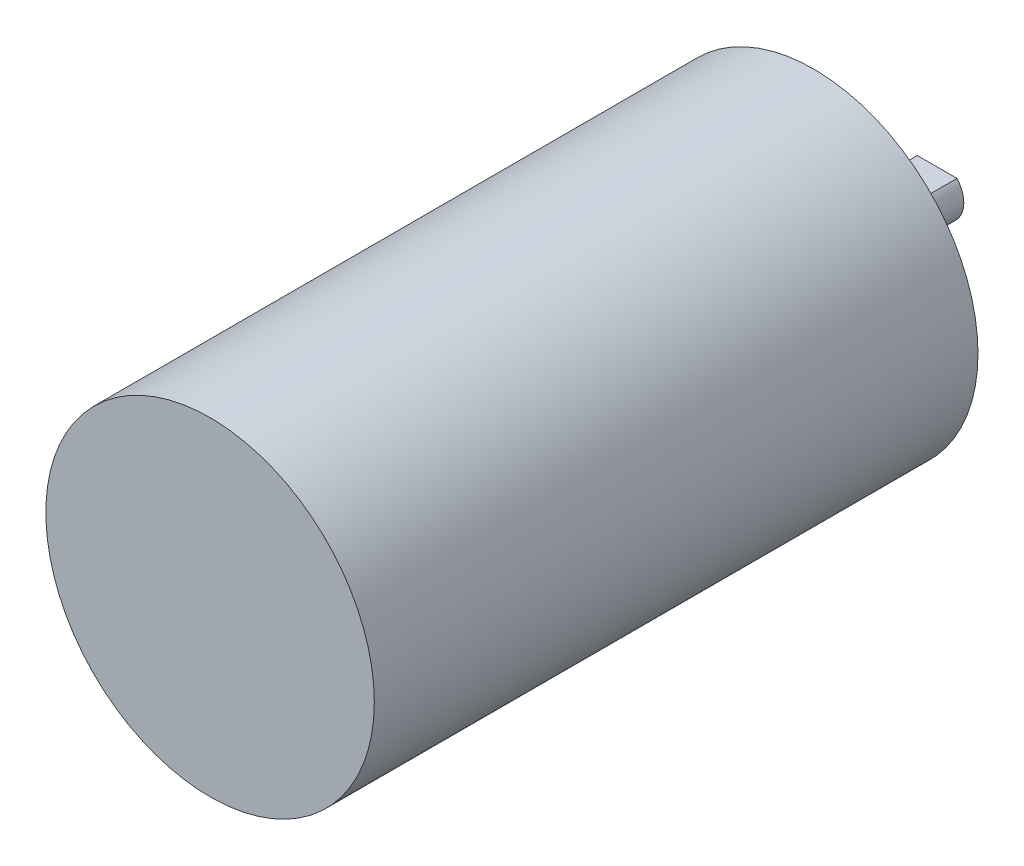
ISO-10303-21;
HEADER;
FILE_DESCRIPTION(('STEP AP214'),'2;1');
FILE_NAME('part.step','',(''),(''),'','','');
FILE_SCHEMA(('AUTOMOTIVE_DESIGN { 1 0 10303 214 1 1 1 1 }'));
ENDSEC;
DATA;
#1=APPLICATION_CONTEXT('core data for automotive mechanical design processes');
#2=APPLICATION_PROTOCOL_DEFINITION('international standard','automotive_design',2000,#1);
#3=PRODUCT_CONTEXT('',#1,'mechanical');
#4=PRODUCT('Part','Part','',(#3));
#5=PRODUCT_RELATED_PRODUCT_CATEGORY('part','',(#4));
#6=PRODUCT_DEFINITION_FORMATION('','',#4);
#7=PRODUCT_DEFINITION_CONTEXT('part definition',#1,'design');
#8=PRODUCT_DEFINITION('design','',#6,#7);
#9=PRODUCT_DEFINITION_SHAPE('','',#8);
#10=(LENGTH_UNIT() NAMED_UNIT(*) SI_UNIT(.MILLI.,.METRE.));
#11=(NAMED_UNIT(*) PLANE_ANGLE_UNIT() SI_UNIT($,.RADIAN.));
#12=(NAMED_UNIT(*) SI_UNIT($,.STERADIAN.) SOLID_ANGLE_UNIT());
#13=UNCERTAINTY_MEASURE_WITH_UNIT(LENGTH_MEASURE(1.E-05),#10,'distance_accuracy_value','');
#14=(GEOMETRIC_REPRESENTATION_CONTEXT(3) GLOBAL_UNCERTAINTY_ASSIGNED_CONTEXT((#13)) GLOBAL_UNIT_ASSIGNED_CONTEXT((#10,
#11,#12)) REPRESENTATION_CONTEXT('',''));
#15=CARTESIAN_POINT('',(0.,0.,0.));
#16=DIRECTION('',(0.,0.,1.));
#17=DIRECTION('',(1.,0.,0.));
#18=AXIS2_PLACEMENT_3D('',#15,#16,#17);
#19=CARTESIAN_POINT('',(0.,0.,68.));
#20=DIRECTION('',(0.,0.,-1.));
#21=DIRECTION('',(-1.,0.,0.));
#22=AXIS2_PLACEMENT_3D('',#19,#20,#21);
#23=CYLINDRICAL_SURFACE('',#22,18.5);
#24=CARTESIAN_POINT('',(0.,0.,68.));
#25=DIRECTION('',(0.,0.,1.));
#26=DIRECTION('',(1.,0.,0.));
#27=AXIS2_PLACEMENT_3D('',#24,#25,#26);
#28=CIRCLE('',#27,18.5);
#29=CARTESIAN_POINT('',(18.5,0.,68.));
#30=VERTEX_POINT('',#29);
#31=EDGE_CURVE('E43',#30,#30,#28,.T.);
#32=ORIENTED_EDGE('',*,*,#31,.F.);
#33=EDGE_LOOP('',(#32));
#34=FACE_BOUND('',#33,.T.);
#35=CARTESIAN_POINT('',(0.,0.,0.));
#36=DIRECTION('',(0.,0.,1.));
#37=DIRECTION('',(1.,0.,0.));
#38=AXIS2_PLACEMENT_3D('',#35,#36,#37);
#39=CIRCLE('',#38,18.5);
#40=CARTESIAN_POINT('',(18.5,0.,0.));
#41=VERTEX_POINT('',#40);
#42=EDGE_CURVE('E38',#41,#41,#39,.T.);
#43=ORIENTED_EDGE('',*,*,#42,.T.);
#44=EDGE_LOOP('',(#43));
#45=FACE_BOUND('',#44,.T.);
#46=ADVANCED_FACE('F35',(#34,#45),#23,.T.);
#47=CARTESIAN_POINT('',(0.,0.,68.));
#48=DIRECTION('',(0.,0.,1.));
#49=DIRECTION('',(1.,0.,0.));
#50=AXIS2_PLACEMENT_3D('',#47,#48,#49);
#51=PLANE('',#50);
#52=ORIENTED_EDGE('',*,*,#31,.T.);
#53=EDGE_LOOP('',(#52));
#54=FACE_BOUND('',#53,.T.);
#55=ADVANCED_FACE('F94',(#54),#51,.T.);
#56=CARTESIAN_POINT('',(0.,0.,0.));
#57=DIRECTION('',(0.,0.,1.));
#58=DIRECTION('',(1.,0.,0.));
#59=AXIS2_PLACEMENT_3D('',#56,#57,#58);
#60=PLANE('',#59);
#61=CARTESIAN_POINT('',(0.,0.,0.));
#62=DIRECTION('',(0.,0.,1.));
#63=DIRECTION('',(1.,0.,0.));
#64=AXIS2_PLACEMENT_3D('',#61,#62,#63);
#65=CIRCLE('',#64,6.);
#66=CARTESIAN_POINT('',(6.,0.,0.));
#67=VERTEX_POINT('',#66);
#68=EDGE_CURVE('E76',#67,#67,#65,.T.);
#69=ORIENTED_EDGE('',*,*,#68,.T.);
#70=EDGE_LOOP('',(#69));
#71=FACE_BOUND('',#70,.T.);
#72=ORIENTED_EDGE('',*,*,#42,.F.);
#73=EDGE_LOOP('',(#72));
#74=FACE_BOUND('',#73,.T.);
#75=ADVANCED_FACE('F91',(#71,#74),#60,.F.);
#76=CARTESIAN_POINT('',(0.,0.,-3.5));
#77=DIRECTION('',(0.,0.,1.));
#78=DIRECTION('',(1.,0.,0.));
#79=AXIS2_PLACEMENT_3D('',#76,#77,#78);
#80=CYLINDRICAL_SURFACE('',#79,6.);
#81=CARTESIAN_POINT('',(0.,0.,-3.5));
#82=DIRECTION('',(0.,0.,1.));
#83=DIRECTION('',(1.,0.,0.));
#84=AXIS2_PLACEMENT_3D('',#81,#82,#83);
#85=CIRCLE('',#84,6.);
#86=CARTESIAN_POINT('',(6.,0.,-3.5));
#87=VERTEX_POINT('',#86);
#88=EDGE_CURVE('E79',#87,#87,#85,.T.);
#89=ORIENTED_EDGE('',*,*,#88,.T.);
#90=EDGE_LOOP('',(#89));
#91=FACE_BOUND('',#90,.T.);
#92=ORIENTED_EDGE('',*,*,#68,.F.);
#93=EDGE_LOOP('',(#92));
#94=FACE_BOUND('',#93,.T.);
#95=ADVANCED_FACE('F93',(#91,#94),#80,.T.);
#96=CARTESIAN_POINT('',(0.,0.,-3.5));
#97=DIRECTION('',(0.,0.,1.));
#98=DIRECTION('',(1.,0.,0.));
#99=AXIS2_PLACEMENT_3D('',#96,#97,#98);
#100=PLANE('',#99);
#101=CARTESIAN_POINT('',(0.,0.,-3.5));
#102=DIRECTION('',(0.,0.,-1.));
#103=DIRECTION('',(-1.,0.,0.));
#104=AXIS2_PLACEMENT_3D('',#101,#102,#103);
#105=CIRCLE('',#104,3.);
#106=CARTESIAN_POINT('',(-3.,0.,-3.5));
#107=VERTEX_POINT('',#106);
#108=EDGE_CURVE('E11',#107,#107,#105,.T.);
#109=ORIENTED_EDGE('',*,*,#108,.F.);
#110=EDGE_LOOP('',(#109));
#111=FACE_BOUND('',#110,.T.);
#112=ORIENTED_EDGE('',*,*,#88,.F.);
#113=EDGE_LOOP('',(#112));
#114=FACE_BOUND('',#113,.T.);
#115=ADVANCED_FACE('F100',(#111,#114),#100,.F.);
#116=CARTESIAN_POINT('',(0.,0.,-13.9));
#117=DIRECTION('',(0.,0.,1.));
#118=DIRECTION('',(1.,0.,0.));
#119=AXIS2_PLACEMENT_3D('',#116,#117,#118);
#120=CYLINDRICAL_SURFACE('',#119,3.);
#121=CARTESIAN_POINT('',(0.,0.,-13.9));
#122=DIRECTION('',(0.,0.,-1.));
#123=DIRECTION('',(-1.,0.,0.));
#124=AXIS2_PLACEMENT_3D('',#121,#122,#123);
#125=CIRCLE('',#124,3.);
#126=CARTESIAN_POINT('',(2.23606797749979,2.,-13.9));
#127=VERTEX_POINT('',#126);
#128=CARTESIAN_POINT('',(-2.23606797749979,2.,-13.9));
#129=VERTEX_POINT('',#128);
#130=EDGE_CURVE('E73',#127,#129,#125,.T.);
#131=ORIENTED_EDGE('',*,*,#130,.F.);
#132=DIRECTION('',(0.,0.,-1.));
#133=VECTOR('',#132,1.);
#134=CARTESIAN_POINT('',(2.23606797749979,2.,-5.9));
#135=LINE('',#134,#133);
#136=CARTESIAN_POINT('',(2.23606797749979,2.,-5.9));
#137=VERTEX_POINT('',#136);
#138=EDGE_CURVE('E51',#137,#127,#135,.T.);
#139=ORIENTED_EDGE('',*,*,#138,.F.);
#140=CARTESIAN_POINT('',(0.,0.,-5.9));
#141=DIRECTION('',(0.,0.,-1.));
#142=DIRECTION('',(-1.,0.,0.));
#143=AXIS2_PLACEMENT_3D('',#140,#141,#142);
#144=CIRCLE('',#143,3.);
#145=CARTESIAN_POINT('',(-2.23606797749979,2.,-5.9));
#146=VERTEX_POINT('',#145);
#147=EDGE_CURVE('E67',#146,#137,#144,.T.);
#148=ORIENTED_EDGE('',*,*,#147,.F.);
#149=DIRECTION('',(0.,0.,-1.));
#150=VECTOR('',#149,1.);
#151=CARTESIAN_POINT('',(-2.23606797749979,2.,-5.9));
#152=LINE('',#151,#150);
#153=EDGE_CURVE('E57',#146,#129,#152,.T.);
#154=ORIENTED_EDGE('',*,*,#153,.T.);
#155=EDGE_LOOP('',(#131,#139,#148,#154));
#156=FACE_BOUND('',#155,.T.);
#157=ORIENTED_EDGE('',*,*,#108,.T.);
#158=EDGE_LOOP('',(#157));
#159=FACE_BOUND('',#158,.T.);
#160=ADVANCED_FACE('F71',(#156,#159),#120,.T.);
#161=CARTESIAN_POINT('',(0.,0.,-13.9));
#162=DIRECTION('',(0.,0.,-1.));
#163=DIRECTION('',(-1.,0.,0.));
#164=AXIS2_PLACEMENT_3D('',#161,#162,#163);
#165=PLANE('',#164);
#166=DIRECTION('',(-1.,0.,0.));
#167=VECTOR('',#166,1.);
#168=CARTESIAN_POINT('',(2.23606797749979,2.,-13.9));
#169=LINE('',#168,#167);
#170=EDGE_CURVE('E62',#127,#129,#169,.T.);
#171=ORIENTED_EDGE('',*,*,#170,.F.);
#172=ORIENTED_EDGE('',*,*,#130,.T.);
#173=EDGE_LOOP('',(#171,#172));
#174=FACE_BOUND('',#173,.T.);
#175=ADVANCED_FACE('F75',(#174),#165,.T.);
#176=CARTESIAN_POINT('',(2.23606797749979,2.,-5.9));
#177=DIRECTION('',(0.,-1.,0.));
#178=DIRECTION('',(0.,0.,-1.));
#179=AXIS2_PLACEMENT_3D('',#176,#177,#178);
#180=PLANE('',#179);
#181=ORIENTED_EDGE('',*,*,#170,.T.);
#182=ORIENTED_EDGE('',*,*,#153,.F.);
#183=DIRECTION('',(-1.,0.,0.));
#184=VECTOR('',#183,1.);
#185=CARTESIAN_POINT('',(2.23606797749979,2.,-5.9));
#186=LINE('',#185,#184);
#187=EDGE_CURVE('E169',#137,#146,#186,.T.);
#188=ORIENTED_EDGE('',*,*,#187,.F.);
#189=ORIENTED_EDGE('',*,*,#138,.T.);
#190=EDGE_LOOP('',(#181,#182,#188,#189));
#191=FACE_BOUND('',#190,.T.);
#192=ADVANCED_FACE('F63',(#191),#180,.F.);
#193=CARTESIAN_POINT('',(0.,0.,-5.9));
#194=DIRECTION('',(0.,0.,-1.));
#195=DIRECTION('',(-1.,0.,0.));
#196=AXIS2_PLACEMENT_3D('',#193,#194,#195);
#197=PLANE('',#196);
#198=ORIENTED_EDGE('',*,*,#147,.T.);
#199=ORIENTED_EDGE('',*,*,#187,.T.);
#200=EDGE_LOOP('',(#198,#199));
#201=FACE_BOUND('',#200,.T.);
#202=ADVANCED_FACE('F156',(#201),#197,.T.);
#203=CLOSED_SHELL('',(#46,#55,#75,#95,#115,#160,#175,#192,#202));
#204=MANIFOLD_SOLID_BREP('B2',#203);
#205=ADVANCED_BREP_SHAPE_REPRESENTATION('',(#18,#204),#14);
#206=SHAPE_DEFINITION_REPRESENTATION(#9,#205);
ENDSEC;
END-ISO-10303-21;
